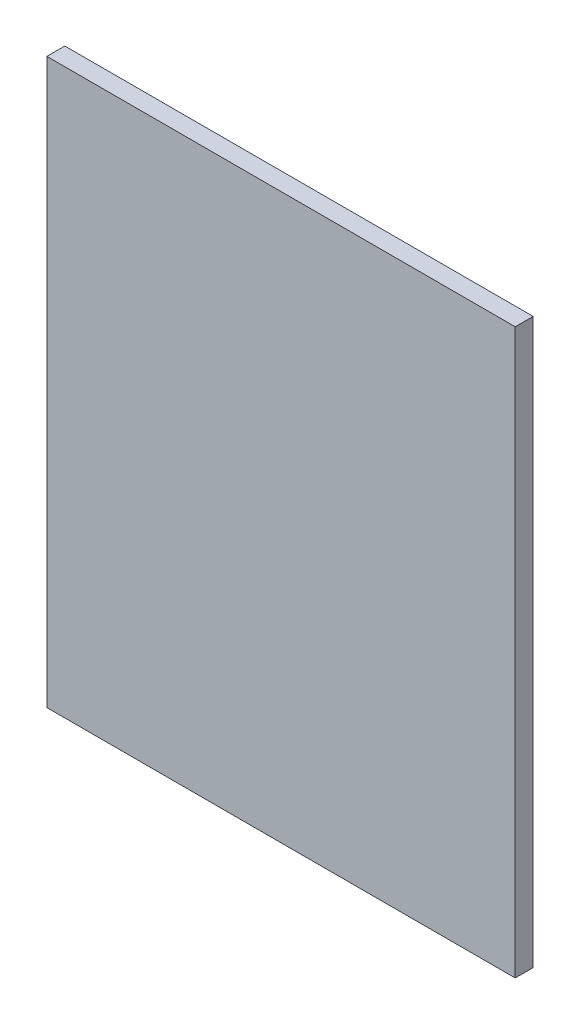
ISO-10303-21;
HEADER;
FILE_DESCRIPTION(('STEP AP214'),'2;1');
FILE_NAME('part.step','',(''),(''),'','','');
FILE_SCHEMA(('AUTOMOTIVE_DESIGN { 1 0 10303 214 1 1 1 1 }'));
ENDSEC;
DATA;
#1=APPLICATION_CONTEXT('core data for automotive mechanical design processes');
#2=APPLICATION_PROTOCOL_DEFINITION('international standard','automotive_design',2000,#1);
#3=PRODUCT_CONTEXT('',#1,'mechanical');
#4=PRODUCT('Part','Part','',(#3));
#5=PRODUCT_RELATED_PRODUCT_CATEGORY('part','',(#4));
#6=PRODUCT_DEFINITION_FORMATION('','',#4);
#7=PRODUCT_DEFINITION_CONTEXT('part definition',#1,'design');
#8=PRODUCT_DEFINITION('design','',#6,#7);
#9=PRODUCT_DEFINITION_SHAPE('','',#8);
#10=(LENGTH_UNIT() NAMED_UNIT(*) SI_UNIT(.MILLI.,.METRE.));
#11=(NAMED_UNIT(*) PLANE_ANGLE_UNIT() SI_UNIT($,.RADIAN.));
#12=(NAMED_UNIT(*) SI_UNIT($,.STERADIAN.) SOLID_ANGLE_UNIT());
#13=UNCERTAINTY_MEASURE_WITH_UNIT(LENGTH_MEASURE(1.E-05),#10,'distance_accuracy_value','');
#14=(GEOMETRIC_REPRESENTATION_CONTEXT(3) GLOBAL_UNCERTAINTY_ASSIGNED_CONTEXT((#13)) GLOBAL_UNIT_ASSIGNED_CONTEXT((#10,
#11,#12)) REPRESENTATION_CONTEXT('',''));
#15=CARTESIAN_POINT('',(0.,0.,0.));
#16=DIRECTION('',(0.,0.,1.));
#17=DIRECTION('',(1.,0.,0.));
#18=AXIS2_PLACEMENT_3D('',#15,#16,#17);
#19=CARTESIAN_POINT('',(235.,-283.,18.));
#20=DIRECTION('',(-1.,0.,0.));
#21=DIRECTION('',(0.,0.,1.));
#22=AXIS2_PLACEMENT_3D('',#19,#20,#21);
#23=PLANE('',#22);
#24=DIRECTION('',(0.,1.,0.));
#25=VECTOR('',#24,1.);
#26=CARTESIAN_POINT('',(235.,-283.,0.));
#27=LINE('',#26,#25);
#28=CARTESIAN_POINT('',(235.,-283.,0.));
#29=VERTEX_POINT('',#28);
#30=CARTESIAN_POINT('',(235.,283.,0.));
#31=VERTEX_POINT('',#30);
#32=EDGE_CURVE('E95',#29,#31,#27,.T.);
#33=ORIENTED_EDGE('',*,*,#32,.T.);
#34=DIRECTION('',(0.,0.,-1.));
#35=VECTOR('',#34,1.);
#36=CARTESIAN_POINT('',(235.,283.,18.));
#37=LINE('',#36,#35);
#38=CARTESIAN_POINT('',(235.,283.,18.));
#39=VERTEX_POINT('',#38);
#40=EDGE_CURVE('E11',#39,#31,#37,.T.);
#41=ORIENTED_EDGE('',*,*,#40,.F.);
#42=DIRECTION('',(0.,1.,0.));
#43=VECTOR('',#42,1.);
#44=CARTESIAN_POINT('',(235.,-283.,18.));
#45=LINE('',#44,#43);
#46=CARTESIAN_POINT('',(235.,-283.,18.));
#47=VERTEX_POINT('',#46);
#48=EDGE_CURVE('E83',#47,#39,#45,.T.);
#49=ORIENTED_EDGE('',*,*,#48,.F.);
#50=DIRECTION('',(0.,0.,-1.));
#51=VECTOR('',#50,1.);
#52=CARTESIAN_POINT('',(235.,-283.,18.));
#53=LINE('',#52,#51);
#54=EDGE_CURVE('E91',#47,#29,#53,.T.);
#55=ORIENTED_EDGE('',*,*,#54,.T.);
#56=EDGE_LOOP('',(#33,#41,#49,#55));
#57=FACE_BOUND('',#56,.T.);
#58=ADVANCED_FACE('F32',(#57),#23,.F.);
#59=CARTESIAN_POINT('',(-235.,283.,18.));
#60=DIRECTION('',(0.,-1.,0.));
#61=DIRECTION('',(0.,0.,-1.));
#62=AXIS2_PLACEMENT_3D('',#59,#60,#61);
#63=PLANE('',#62);
#64=DIRECTION('',(-1.,0.,0.));
#65=VECTOR('',#64,1.);
#66=CARTESIAN_POINT('',(-235.,283.,0.));
#67=LINE('',#66,#65);
#68=CARTESIAN_POINT('',(-235.,283.,0.));
#69=VERTEX_POINT('',#68);
#70=EDGE_CURVE('E87',#31,#69,#67,.T.);
#71=ORIENTED_EDGE('',*,*,#70,.T.);
#72=DIRECTION('',(0.,0.,-1.));
#73=VECTOR('',#72,1.);
#74=CARTESIAN_POINT('',(-235.,283.,18.));
#75=LINE('',#74,#73);
#76=CARTESIAN_POINT('',(-235.,283.,18.));
#77=VERTEX_POINT('',#76);
#78=EDGE_CURVE('E40',#77,#69,#75,.T.);
#79=ORIENTED_EDGE('',*,*,#78,.F.);
#80=DIRECTION('',(-1.,0.,0.));
#81=VECTOR('',#80,1.);
#82=CARTESIAN_POINT('',(-235.,283.,18.));
#83=LINE('',#82,#81);
#84=EDGE_CURVE('E78',#39,#77,#83,.T.);
#85=ORIENTED_EDGE('',*,*,#84,.F.);
#86=ORIENTED_EDGE('',*,*,#40,.T.);
#87=EDGE_LOOP('',(#71,#79,#85,#86));
#88=FACE_BOUND('',#87,.T.);
#89=ADVANCED_FACE('F86',(#88),#63,.F.);
#90=CARTESIAN_POINT('',(-235.,-283.,18.));
#91=DIRECTION('',(1.,0.,0.));
#92=DIRECTION('',(0.,0.,-1.));
#93=AXIS2_PLACEMENT_3D('',#90,#91,#92);
#94=PLANE('',#93);
#95=DIRECTION('',(0.,-1.,0.));
#96=VECTOR('',#95,1.);
#97=CARTESIAN_POINT('',(-235.,-283.,0.));
#98=LINE('',#97,#96);
#99=CARTESIAN_POINT('',(-235.,-283.,0.));
#100=VERTEX_POINT('',#99);
#101=EDGE_CURVE('E65',#69,#100,#98,.T.);
#102=ORIENTED_EDGE('',*,*,#101,.T.);
#103=DIRECTION('',(0.,0.,-1.));
#104=VECTOR('',#103,1.);
#105=CARTESIAN_POINT('',(-235.,-283.,18.));
#106=LINE('',#105,#104);
#107=CARTESIAN_POINT('',(-235.,-283.,18.));
#108=VERTEX_POINT('',#107);
#109=EDGE_CURVE('E88',#108,#100,#106,.T.);
#110=ORIENTED_EDGE('',*,*,#109,.F.);
#111=DIRECTION('',(0.,-1.,0.));
#112=VECTOR('',#111,1.);
#113=CARTESIAN_POINT('',(-235.,-283.,18.));
#114=LINE('',#113,#112);
#115=EDGE_CURVE('E81',#77,#108,#114,.T.);
#116=ORIENTED_EDGE('',*,*,#115,.F.);
#117=ORIENTED_EDGE('',*,*,#78,.T.);
#118=EDGE_LOOP('',(#102,#110,#116,#117));
#119=FACE_BOUND('',#118,.T.);
#120=ADVANCED_FACE('F89',(#119),#94,.F.);
#121=CARTESIAN_POINT('',(-235.,-283.,18.));
#122=DIRECTION('',(0.,1.,0.));
#123=DIRECTION('',(0.,0.,1.));
#124=AXIS2_PLACEMENT_3D('',#121,#122,#123);
#125=PLANE('',#124);
#126=DIRECTION('',(1.,0.,0.));
#127=VECTOR('',#126,1.);
#128=CARTESIAN_POINT('',(-235.,-283.,0.));
#129=LINE('',#128,#127);
#130=EDGE_CURVE('E71',#100,#29,#129,.T.);
#131=ORIENTED_EDGE('',*,*,#130,.T.);
#132=ORIENTED_EDGE('',*,*,#54,.F.);
#133=DIRECTION('',(1.,0.,0.));
#134=VECTOR('',#133,1.);
#135=CARTESIAN_POINT('',(-235.,-283.,18.));
#136=LINE('',#135,#134);
#137=EDGE_CURVE('E48',#108,#47,#136,.T.);
#138=ORIENTED_EDGE('',*,*,#137,.F.);
#139=ORIENTED_EDGE('',*,*,#109,.T.);
#140=EDGE_LOOP('',(#131,#132,#138,#139));
#141=FACE_BOUND('',#140,.T.);
#142=ADVANCED_FACE('F102',(#141),#125,.F.);
#143=CARTESIAN_POINT('',(0.,0.,18.));
#144=DIRECTION('',(0.,0.,-1.));
#145=DIRECTION('',(-1.,0.,0.));
#146=AXIS2_PLACEMENT_3D('',#143,#144,#145);
#147=PLANE('',#146);
#148=ORIENTED_EDGE('',*,*,#48,.T.);
#149=ORIENTED_EDGE('',*,*,#84,.T.);
#150=ORIENTED_EDGE('',*,*,#115,.T.);
#151=ORIENTED_EDGE('',*,*,#137,.T.);
#152=EDGE_LOOP('',(#148,#149,#150,#151));
#153=FACE_BOUND('',#152,.T.);
#154=ADVANCED_FACE('F79',(#153),#147,.F.);
#155=CARTESIAN_POINT('',(0.,0.,0.));
#156=DIRECTION('',(0.,0.,-1.));
#157=DIRECTION('',(-1.,0.,0.));
#158=AXIS2_PLACEMENT_3D('',#155,#156,#157);
#159=PLANE('',#158);
#160=ORIENTED_EDGE('',*,*,#32,.F.);
#161=ORIENTED_EDGE('',*,*,#130,.F.);
#162=ORIENTED_EDGE('',*,*,#101,.F.);
#163=ORIENTED_EDGE('',*,*,#70,.F.);
#164=EDGE_LOOP('',(#160,#161,#162,#163));
#165=FACE_BOUND('',#164,.T.);
#166=ADVANCED_FACE('F105',(#165),#159,.T.);
#167=CLOSED_SHELL('',(#58,#89,#120,#142,#154,#166));
#168=MANIFOLD_SOLID_BREP('B2',#167);
#169=ADVANCED_BREP_SHAPE_REPRESENTATION('',(#18,#168),#14);
#170=SHAPE_DEFINITION_REPRESENTATION(#9,#169);
ENDSEC;
END-ISO-10303-21;
